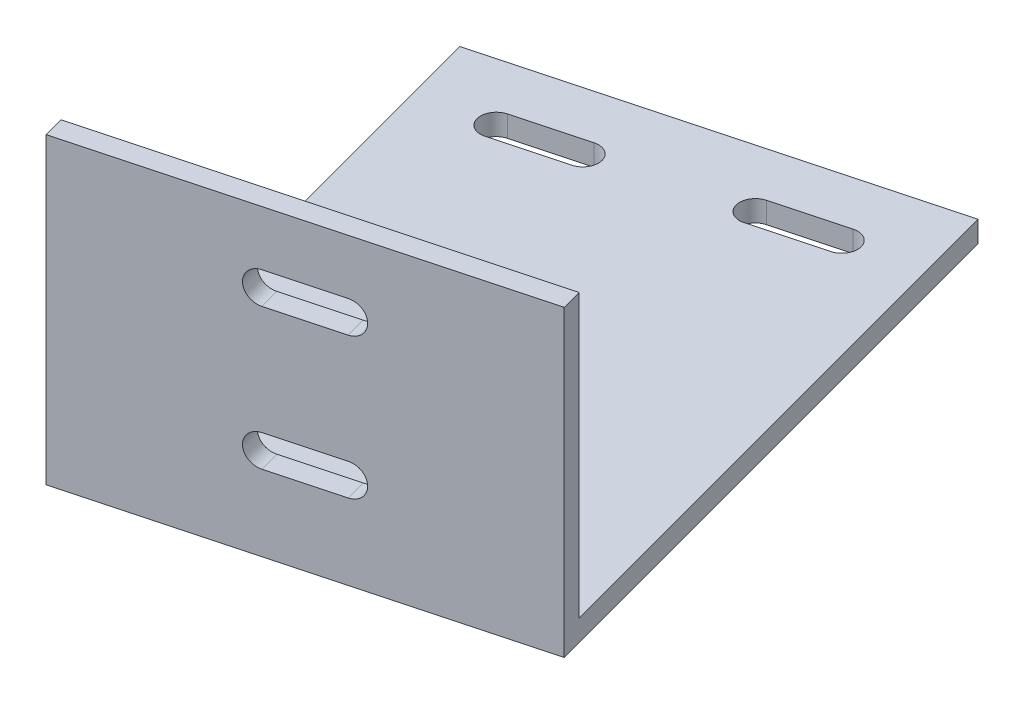
ISO-10303-21;
HEADER;
FILE_DESCRIPTION(('STEP AP214'),'2;1');
FILE_NAME('part.step','',(''),(''),'','','');
FILE_SCHEMA(('AUTOMOTIVE_DESIGN { 1 0 10303 214 1 1 1 1 }'));
ENDSEC;
DATA;
#1=APPLICATION_CONTEXT('core data for automotive mechanical design processes');
#2=APPLICATION_PROTOCOL_DEFINITION('international standard','automotive_design',2000,#1);
#3=PRODUCT_CONTEXT('',#1,'mechanical');
#4=PRODUCT('Part','Part','',(#3));
#5=PRODUCT_RELATED_PRODUCT_CATEGORY('part','',(#4));
#6=PRODUCT_DEFINITION_FORMATION('','',#4);
#7=PRODUCT_DEFINITION_CONTEXT('part definition',#1,'design');
#8=PRODUCT_DEFINITION('design','',#6,#7);
#9=PRODUCT_DEFINITION_SHAPE('','',#8);
#10=(LENGTH_UNIT() NAMED_UNIT(*) SI_UNIT(.MILLI.,.METRE.));
#11=(NAMED_UNIT(*) PLANE_ANGLE_UNIT() SI_UNIT($,.RADIAN.));
#12=(NAMED_UNIT(*) SI_UNIT($,.STERADIAN.) SOLID_ANGLE_UNIT());
#13=UNCERTAINTY_MEASURE_WITH_UNIT(LENGTH_MEASURE(1.E-05),#10,'distance_accuracy_value','');
#14=(GEOMETRIC_REPRESENTATION_CONTEXT(3) GLOBAL_UNCERTAINTY_ASSIGNED_CONTEXT((#13)) GLOBAL_UNIT_ASSIGNED_CONTEXT((#10,
#11,#12)) REPRESENTATION_CONTEXT('',''));
#15=CARTESIAN_POINT('',(0.,0.,0.));
#16=DIRECTION('',(0.,0.,1.));
#17=DIRECTION('',(1.,0.,0.));
#18=AXIS2_PLACEMENT_3D('',#15,#16,#17);
#19=CARTESIAN_POINT('',(1820.88273357,-1599.,2444.101414841));
#20=DIRECTION('',(-0.258819045102985,0.,-0.965925826288944));
#21=DIRECTION('',(0.,1.,0.));
#22=AXIS2_PLACEMENT_3D('',#19,#20,#21);
#23=CYLINDRICAL_SURFACE('',#22,4.5);
#24=DIRECTION('',(0.258819045102985,0.,0.965925826288944));
#25=VECTOR('',#24,1.);
#26=CARTESIAN_POINT('',(1820.88273357,-1603.5,2444.101414841));
#27=LINE('',#26,#25);
#28=CARTESIAN_POINT('',(1820.88532176,-1603.5,2444.111074099));
#29=VERTEX_POINT('',#28);
#30=CARTESIAN_POINT('',(1822.438236031,-1603.5,2449.906629057));
#31=VERTEX_POINT('',#30);
#32=EDGE_CURVE('E11',#29,#31,#27,.T.);
#33=ORIENTED_EDGE('',*,*,#32,.T.);
#34=CARTESIAN_POINT('',(1822.438236031,-1599.,2449.906629057));
#35=DIRECTION('',(-0.258819045102985,0.,-0.965925826288944));
#36=DIRECTION('',(0.,1.,0.));
#37=AXIS2_PLACEMENT_3D('',#34,#35,#36);
#38=CIRCLE('',#37,4.5);
#39=CARTESIAN_POINT('',(1822.438236031,-1594.5,2449.906629057));
#40=VERTEX_POINT('',#39);
#41=EDGE_CURVE('E221',#40,#31,#38,.T.);
#42=ORIENTED_EDGE('',*,*,#41,.F.);
#43=DIRECTION('',(0.258819045102985,0.,0.965925826288944));
#44=VECTOR('',#43,1.);
#45=CARTESIAN_POINT('',(1820.88273357,-1594.5,2444.101414841));
#46=LINE('',#45,#44);
#47=CARTESIAN_POINT('',(1820.88532176,-1594.5,2444.111074099));
#48=VERTEX_POINT('',#47);
#49=EDGE_CURVE('E207',#48,#40,#46,.T.);
#50=ORIENTED_EDGE('',*,*,#49,.F.);
#51=CARTESIAN_POINT('',(1820.88532176,-1599.,2444.111074099));
#52=DIRECTION('',(-0.258819045102985,0.,-0.965925826288944));
#53=DIRECTION('',(0.,1.,0.));
#54=AXIS2_PLACEMENT_3D('',#51,#52,#53);
#55=CIRCLE('',#54,4.5);
#56=EDGE_CURVE('E617',#48,#29,#55,.T.);
#57=ORIENTED_EDGE('',*,*,#56,.T.);
#58=EDGE_LOOP('',(#33,#42,#50,#57));
#59=FACE_BOUND('',#58,.T.);
#60=ADVANCED_FACE('F17',(#59),#23,.F.);
#61=CARTESIAN_POINT('',(1820.88273357,-1603.5,2444.101414841));
#62=DIRECTION('',(0.,-1.,0.));
#63=DIRECTION('',(0.,0.,-1.));
#64=AXIS2_PLACEMENT_3D('',#61,#62,#63);
#65=PLANE('',#64);
#66=DIRECTION('',(0.258819045102985,0.,0.965925826288944));
#67=VECTOR('',#66,1.);
#68=CARTESIAN_POINT('',(1801.564217044,-1603.5,2449.277795743));
#69=LINE('',#68,#67);
#70=CARTESIAN_POINT('',(1801.566805235,-1603.5,2449.287455001));
#71=VERTEX_POINT('',#70);
#72=CARTESIAN_POINT('',(1803.119719505,-1603.5,2455.083009959));
#73=VERTEX_POINT('',#72);
#74=EDGE_CURVE('E27',#71,#73,#69,.T.);
#75=ORIENTED_EDGE('',*,*,#74,.T.);
#76=DIRECTION('',(0.965925826288944,0.,-0.258819045102985));
#77=VECTOR('',#76,1.);
#78=CARTESIAN_POINT('',(1788.630832111,-1603.5,2458.965295635));
#79=LINE('',#78,#77);
#80=EDGE_CURVE('E214',#73,#31,#79,.T.);
#81=ORIENTED_EDGE('',*,*,#80,.T.);
#82=ORIENTED_EDGE('',*,*,#32,.F.);
#83=DIRECTION('',(0.965925826288944,0.,-0.258819045102985));
#84=VECTOR('',#83,1.);
#85=CARTESIAN_POINT('',(1787.07791784,-1603.5,2453.169740677));
#86=LINE('',#85,#84);
#87=EDGE_CURVE('E613',#71,#29,#86,.T.);
#88=ORIENTED_EDGE('',*,*,#87,.F.);
#89=EDGE_LOOP('',(#75,#81,#82,#88));
#90=FACE_BOUND('',#89,.T.);
#91=ADVANCED_FACE('F19',(#90),#65,.F.);
#92=CARTESIAN_POINT('',(1801.564217044,-1599.,2449.277795743));
#93=DIRECTION('',(-0.258819045102985,0.,-0.965925826288944));
#94=DIRECTION('',(0.,-1.,0.));
#95=AXIS2_PLACEMENT_3D('',#92,#93,#94);
#96=CYLINDRICAL_SURFACE('',#95,4.5);
#97=DIRECTION('',(0.258819045102985,0.,0.965925826288944));
#98=VECTOR('',#97,1.);
#99=CARTESIAN_POINT('',(1801.564217044,-1594.5,2449.277795743));
#100=LINE('',#99,#98);
#101=CARTESIAN_POINT('',(1801.566805235,-1594.5,2449.287455001));
#102=VERTEX_POINT('',#101);
#103=CARTESIAN_POINT('',(1803.119719505,-1594.5,2455.083009959));
#104=VERTEX_POINT('',#103);
#105=EDGE_CURVE('E195',#102,#104,#100,.T.);
#106=ORIENTED_EDGE('',*,*,#105,.T.);
#107=CARTESIAN_POINT('',(1803.119719505,-1599.,2455.083009959));
#108=DIRECTION('',(-0.258819045102985,0.,-0.965925826288944));
#109=DIRECTION('',(0.,-1.,0.));
#110=AXIS2_PLACEMENT_3D('',#107,#108,#109);
#111=CIRCLE('',#110,4.5);
#112=EDGE_CURVE('E198',#73,#104,#111,.T.);
#113=ORIENTED_EDGE('',*,*,#112,.F.);
#114=ORIENTED_EDGE('',*,*,#74,.F.);
#115=CARTESIAN_POINT('',(1801.566805235,-1599.,2449.287455001));
#116=DIRECTION('',(-0.258819045102985,0.,-0.965925826288944));
#117=DIRECTION('',(0.,-1.,0.));
#118=AXIS2_PLACEMENT_3D('',#115,#116,#117);
#119=CIRCLE('',#118,4.5);
#120=EDGE_CURVE('E201',#71,#102,#119,.T.);
#121=ORIENTED_EDGE('',*,*,#120,.T.);
#122=EDGE_LOOP('',(#106,#113,#114,#121));
#123=FACE_BOUND('',#122,.T.);
#124=ADVANCED_FACE('F197',(#123),#96,.F.);
#125=CARTESIAN_POINT('',(1801.564217044,-1594.5,2449.277795743));
#126=DIRECTION('',(0.,1.,0.));
#127=DIRECTION('',(1.,0.,0.));
#128=AXIS2_PLACEMENT_3D('',#125,#126,#127);
#129=PLANE('',#128);
#130=ORIENTED_EDGE('',*,*,#49,.T.);
#131=DIRECTION('',(-0.965925826288944,0.,0.258819045102985));
#132=VECTOR('',#131,1.);
#133=CARTESIAN_POINT('',(1778.971573848,-1594.5,2461.553486086));
#134=LINE('',#133,#132);
#135=EDGE_CURVE('E213',#40,#104,#134,.T.);
#136=ORIENTED_EDGE('',*,*,#135,.T.);
#137=ORIENTED_EDGE('',*,*,#105,.F.);
#138=DIRECTION('',(-0.965925826288944,0.,0.258819045102985));
#139=VECTOR('',#138,1.);
#140=CARTESIAN_POINT('',(1777.418659577,-1594.5,2455.757931128));
#141=LINE('',#140,#139);
#142=EDGE_CURVE('E483',#48,#102,#141,.T.);
#143=ORIENTED_EDGE('',*,*,#142,.F.);
#144=EDGE_LOOP('',(#130,#136,#137,#143));
#145=FACE_BOUND('',#144,.T.);
#146=ADVANCED_FACE('F218',(#145),#129,.F.);
#147=CARTESIAN_POINT('',(1820.88273357,-1643.5,2444.101414841));
#148=DIRECTION('',(0.,-1.,0.));
#149=DIRECTION('',(0.,0.,-1.));
#150=AXIS2_PLACEMENT_3D('',#147,#148,#149);
#151=PLANE('',#150);
#152=DIRECTION('',(0.258819045102985,0.,0.965925826288944));
#153=VECTOR('',#152,1.);
#154=CARTESIAN_POINT('',(1801.564217044,-1643.5,2449.277795743));
#155=LINE('',#154,#153);
#156=CARTESIAN_POINT('',(1801.566805235,-1643.5,2449.287455001));
#157=VERTEX_POINT('',#156);
#158=CARTESIAN_POINT('',(1803.119719505,-1643.5,2455.083009959));
#159=VERTEX_POINT('',#158);
#160=EDGE_CURVE('E261',#157,#159,#155,.T.);
#161=ORIENTED_EDGE('',*,*,#160,.T.);
#162=DIRECTION('',(0.965925826288944,0.,-0.258819045102985));
#163=VECTOR('',#162,1.);
#164=CARTESIAN_POINT('',(1788.630832111,-1643.5,2458.965295635));
#165=LINE('',#164,#163);
#166=CARTESIAN_POINT('',(1822.438236031,-1643.5,2449.906629057));
#167=VERTEX_POINT('',#166);
#168=EDGE_CURVE('E231',#159,#167,#165,.T.);
#169=ORIENTED_EDGE('',*,*,#168,.T.);
#170=DIRECTION('',(0.258819045102985,0.,0.965925826288944));
#171=VECTOR('',#170,1.);
#172=CARTESIAN_POINT('',(1820.88273357,-1643.5,2444.101414841));
#173=LINE('',#172,#171);
#174=CARTESIAN_POINT('',(1820.88532176,-1643.5,2444.111074099));
#175=VERTEX_POINT('',#174);
#176=EDGE_CURVE('E258',#175,#167,#173,.T.);
#177=ORIENTED_EDGE('',*,*,#176,.F.);
#178=DIRECTION('',(0.965925826288944,0.,-0.258819045102985));
#179=VECTOR('',#178,1.);
#180=CARTESIAN_POINT('',(1787.07791784,-1643.5,2453.169740677));
#181=LINE('',#180,#179);
#182=EDGE_CURVE('E539',#157,#175,#181,.T.);
#183=ORIENTED_EDGE('',*,*,#182,.F.);
#184=EDGE_LOOP('',(#161,#169,#177,#183));
#185=FACE_BOUND('',#184,.T.);
#186=ADVANCED_FACE('F427',(#185),#151,.F.);
#187=CARTESIAN_POINT('',(1801.564217044,-1639.,2449.277795743));
#188=DIRECTION('',(-0.258819045102985,0.,-0.965925826288944));
#189=DIRECTION('',(0.,-1.,0.));
#190=AXIS2_PLACEMENT_3D('',#187,#188,#189);
#191=CYLINDRICAL_SURFACE('',#190,4.5);
#192=DIRECTION('',(0.258819045102985,0.,0.965925826288944));
#193=VECTOR('',#192,1.);
#194=CARTESIAN_POINT('',(1801.564217044,-1634.5,2449.277795743));
#195=LINE('',#194,#193);
#196=CARTESIAN_POINT('',(1801.566805235,-1634.5,2449.287455001));
#197=VERTEX_POINT('',#196);
#198=CARTESIAN_POINT('',(1803.119719505,-1634.5,2455.083009959));
#199=VERTEX_POINT('',#198);
#200=EDGE_CURVE('E255',#197,#199,#195,.T.);
#201=ORIENTED_EDGE('',*,*,#200,.T.);
#202=CARTESIAN_POINT('',(1803.119719505,-1639.,2455.083009959));
#203=DIRECTION('',(-0.258819045102985,0.,-0.965925826288944));
#204=DIRECTION('',(0.,-1.,0.));
#205=AXIS2_PLACEMENT_3D('',#202,#203,#204);
#206=CIRCLE('',#205,4.5);
#207=EDGE_CURVE('E222',#159,#199,#206,.T.);
#208=ORIENTED_EDGE('',*,*,#207,.F.);
#209=ORIENTED_EDGE('',*,*,#160,.F.);
#210=CARTESIAN_POINT('',(1801.566805235,-1639.,2449.287455001));
#211=DIRECTION('',(-0.258819045102985,0.,-0.965925826288944));
#212=DIRECTION('',(0.,-1.,0.));
#213=AXIS2_PLACEMENT_3D('',#210,#211,#212);
#214=CIRCLE('',#213,4.5);
#215=EDGE_CURVE('E544',#157,#197,#214,.T.);
#216=ORIENTED_EDGE('',*,*,#215,.T.);
#217=EDGE_LOOP('',(#201,#208,#209,#216));
#218=FACE_BOUND('',#217,.T.);
#219=ADVANCED_FACE('F419',(#218),#191,.F.);
#220=CARTESIAN_POINT('',(1820.88273357,-1639.,2444.101414841));
#221=DIRECTION('',(-0.258819045102985,0.,-0.965925826288944));
#222=DIRECTION('',(0.,1.,0.));
#223=AXIS2_PLACEMENT_3D('',#220,#221,#222);
#224=CYLINDRICAL_SURFACE('',#223,4.5);
#225=ORIENTED_EDGE('',*,*,#176,.T.);
#226=CARTESIAN_POINT('',(1822.438236031,-1639.,2449.906629057));
#227=DIRECTION('',(-0.258819045102985,0.,-0.965925826288944));
#228=DIRECTION('',(0.,1.,0.));
#229=AXIS2_PLACEMENT_3D('',#226,#227,#228);
#230=CIRCLE('',#229,4.5);
#231=CARTESIAN_POINT('',(1822.438236031,-1634.5,2449.906629057));
#232=VERTEX_POINT('',#231);
#233=EDGE_CURVE('E644',#232,#167,#230,.T.);
#234=ORIENTED_EDGE('',*,*,#233,.F.);
#235=DIRECTION('',(0.258819045102985,0.,0.965925826288944));
#236=VECTOR('',#235,1.);
#237=CARTESIAN_POINT('',(1820.88273357,-1634.5,2444.101414841));
#238=LINE('',#237,#236);
#239=CARTESIAN_POINT('',(1820.88532176,-1634.5,2444.111074099));
#240=VERTEX_POINT('',#239);
#241=EDGE_CURVE('E254',#240,#232,#238,.T.);
#242=ORIENTED_EDGE('',*,*,#241,.F.);
#243=CARTESIAN_POINT('',(1820.88532176,-1639.,2444.111074099));
#244=DIRECTION('',(-0.258819045102985,0.,-0.965925826288944));
#245=DIRECTION('',(0.,1.,0.));
#246=AXIS2_PLACEMENT_3D('',#243,#244,#245);
#247=CIRCLE('',#246,4.5);
#248=EDGE_CURVE('E543',#240,#175,#247,.T.);
#249=ORIENTED_EDGE('',*,*,#248,.T.);
#250=EDGE_LOOP('',(#225,#234,#242,#249));
#251=FACE_BOUND('',#250,.T.);
#252=ADVANCED_FACE('F411',(#251),#224,.F.);
#253=CARTESIAN_POINT('',(1801.564217044,-1634.5,2449.277795743));
#254=DIRECTION('',(0.,1.,0.));
#255=DIRECTION('',(1.,0.,0.));
#256=AXIS2_PLACEMENT_3D('',#253,#254,#255);
#257=PLANE('',#256);
#258=ORIENTED_EDGE('',*,*,#241,.T.);
#259=DIRECTION('',(-0.965925826288944,0.,0.258819045102985));
#260=VECTOR('',#259,1.);
#261=CARTESIAN_POINT('',(1778.971573848,-1634.5,2461.553486086));
#262=LINE('',#261,#260);
#263=EDGE_CURVE('E640',#232,#199,#262,.T.);
#264=ORIENTED_EDGE('',*,*,#263,.T.);
#265=ORIENTED_EDGE('',*,*,#200,.F.);
#266=DIRECTION('',(-0.965925826288944,0.,0.258819045102985));
#267=VECTOR('',#266,1.);
#268=CARTESIAN_POINT('',(1777.418659577,-1634.5,2455.757931128));
#269=LINE('',#268,#267);
#270=EDGE_CURVE('E588',#240,#197,#269,.T.);
#271=ORIENTED_EDGE('',*,*,#270,.F.);
#272=EDGE_LOOP('',(#258,#264,#265,#271));
#273=FACE_BOUND('',#272,.T.);
#274=ADVANCED_FACE('F366',(#273),#257,.F.);
#275=CARTESIAN_POINT('',(1813.628430235,-1665.01,2301.116887065));
#276=DIRECTION('',(0.,-1.,0.));
#277=DIRECTION('',(-0.258819045102985,0.,-0.965925826288944));
#278=AXIS2_PLACEMENT_3D('',#275,#276,#277);
#279=CYLINDRICAL_SURFACE('',#278,4.5);
#280=DIRECTION('',(0.,1.,0.));
#281=VECTOR('',#280,1.);
#282=CARTESIAN_POINT('',(1814.793115938,-1665.01,2305.463553284));
#283=LINE('',#282,#281);
#284=CARTESIAN_POINT('',(1814.793115938,-1665.,2305.463553284));
#285=VERTEX_POINT('',#284);
#286=CARTESIAN_POINT('',(1814.793115938,-1659.,2305.463553284));
#287=VERTEX_POINT('',#286);
#288=EDGE_CURVE('E251',#285,#287,#283,.T.);
#289=ORIENTED_EDGE('',*,*,#288,.T.);
#290=CARTESIAN_POINT('',(1813.628430235,-1659.,2301.116887065));
#291=DIRECTION('',(0.,-1.,0.));
#292=DIRECTION('',(-0.258819045102985,0.,-0.965925826288944));
#293=AXIS2_PLACEMENT_3D('',#290,#291,#292);
#294=CIRCLE('',#293,4.5);
#295=CARTESIAN_POINT('',(1812.463744532,-1659.,2296.770220847));
#296=VERTEX_POINT('',#295);
#297=EDGE_CURVE('E596',#296,#287,#294,.T.);
#298=ORIENTED_EDGE('',*,*,#297,.F.);
#299=DIRECTION('',(0.,1.,0.));
#300=VECTOR('',#299,1.);
#301=CARTESIAN_POINT('',(1812.463744532,-1665.01,2296.770220847));
#302=LINE('',#301,#300);
#303=CARTESIAN_POINT('',(1812.463744532,-1665.,2296.770220847));
#304=VERTEX_POINT('',#303);
#305=EDGE_CURVE('E244',#304,#296,#302,.T.);
#306=ORIENTED_EDGE('',*,*,#305,.F.);
#307=CARTESIAN_POINT('',(1813.628430235,-1665.,2301.116887065));
#308=DIRECTION('',(0.,-1.,0.));
#309=DIRECTION('',(-0.258819045102985,0.,-0.965925826288944));
#310=AXIS2_PLACEMENT_3D('',#307,#308,#309);
#311=CIRCLE('',#310,4.5);
#312=EDGE_CURVE('E534',#304,#285,#311,.T.);
#313=ORIENTED_EDGE('',*,*,#312,.T.);
#314=EDGE_LOOP('',(#289,#298,#306,#313));
#315=FACE_BOUND('',#314,.T.);
#316=ADVANCED_FACE('F361',(#315),#279,.F.);
#317=CARTESIAN_POINT('',(1814.793115938,-1665.01,2305.463553284));
#318=DIRECTION('',(0.258819045102985,0.,0.965925826288944));
#319=DIRECTION('',(0.,-1.,0.));
#320=AXIS2_PLACEMENT_3D('',#317,#318,#319);
#321=PLANE('',#320);
#322=DIRECTION('',(0.,1.,0.));
#323=VECTOR('',#322,1.);
#324=CARTESIAN_POINT('',(1795.474599412,-1665.01,2310.639934186));
#325=LINE('',#324,#323);
#326=CARTESIAN_POINT('',(1795.474599412,-1665.,2310.639934186));
#327=VERTEX_POINT('',#326);
#328=CARTESIAN_POINT('',(1795.474599412,-1659.,2310.639934186));
#329=VERTEX_POINT('',#328);
#330=EDGE_CURVE('E248',#327,#329,#325,.T.);
#331=ORIENTED_EDGE('',*,*,#330,.T.);
#332=DIRECTION('',(0.965925826288944,0.,-0.258819045102985));
#333=VECTOR('',#332,1.);
#334=CARTESIAN_POINT('',(1766.496824623,-1659.,2318.404505539));
#335=LINE('',#334,#333);
#336=EDGE_CURVE('E600',#329,#287,#335,.T.);
#337=ORIENTED_EDGE('',*,*,#336,.T.);
#338=ORIENTED_EDGE('',*,*,#288,.F.);
#339=DIRECTION('',(0.965925826288944,0.,-0.258819045102985));
#340=VECTOR('',#339,1.);
#341=CARTESIAN_POINT('',(1766.496824623,-1665.,2318.404505539));
#342=LINE('',#341,#340);
#343=EDGE_CURVE('E509',#327,#285,#342,.T.);
#344=ORIENTED_EDGE('',*,*,#343,.F.);
#345=EDGE_LOOP('',(#331,#337,#338,#344));
#346=FACE_BOUND('',#345,.T.);
#347=ADVANCED_FACE('F365',(#346),#321,.F.);
#348=CARTESIAN_POINT('',(1794.309913709,-1665.01,2306.293267967));
#349=DIRECTION('',(0.,-1.,0.));
#350=DIRECTION('',(0.258819045102985,0.,0.965925826288944));
#351=AXIS2_PLACEMENT_3D('',#348,#349,#350);
#352=CYLINDRICAL_SURFACE('',#351,4.5);
#353=DIRECTION('',(0.,1.,0.));
#354=VECTOR('',#353,1.);
#355=CARTESIAN_POINT('',(1793.145228006,-1665.01,2301.946601749));
#356=LINE('',#355,#354);
#357=CARTESIAN_POINT('',(1793.145228006,-1665.,2301.946601749));
#358=VERTEX_POINT('',#357);
#359=CARTESIAN_POINT('',(1793.145228006,-1659.,2301.946601749));
#360=VERTEX_POINT('',#359);
#361=EDGE_CURVE('E247',#358,#360,#356,.T.);
#362=ORIENTED_EDGE('',*,*,#361,.T.);
#363=CARTESIAN_POINT('',(1794.309913709,-1659.,2306.293267967));
#364=DIRECTION('',(0.,-1.,0.));
#365=DIRECTION('',(0.258819045102985,0.,0.965925826288944));
#366=AXIS2_PLACEMENT_3D('',#363,#364,#365);
#367=CIRCLE('',#366,4.5);
#368=EDGE_CURVE('E605',#329,#360,#367,.T.);
#369=ORIENTED_EDGE('',*,*,#368,.F.);
#370=ORIENTED_EDGE('',*,*,#330,.F.);
#371=CARTESIAN_POINT('',(1794.309913709,-1665.,2306.293267967));
#372=DIRECTION('',(0.,-1.,0.));
#373=DIRECTION('',(0.258819045102985,0.,0.965925826288944));
#374=AXIS2_PLACEMENT_3D('',#371,#372,#373);
#375=CIRCLE('',#374,4.5);
#376=EDGE_CURVE('E507',#327,#358,#375,.T.);
#377=ORIENTED_EDGE('',*,*,#376,.T.);
#378=EDGE_LOOP('',(#362,#369,#370,#377));
#379=FACE_BOUND('',#378,.T.);
#380=ADVANCED_FACE('F389',(#379),#352,.F.);
#381=CARTESIAN_POINT('',(1793.145228006,-1665.01,2301.946601749));
#382=DIRECTION('',(-0.258819045102985,0.,-0.965925826288944));
#383=DIRECTION('',(-0.965925826288944,0.,0.258819045102985));
#384=AXIS2_PLACEMENT_3D('',#381,#382,#383);
#385=PLANE('',#384);
#386=ORIENTED_EDGE('',*,*,#305,.T.);
#387=DIRECTION('',(-0.965925826288944,0.,0.258819045102985));
#388=VECTOR('',#387,1.);
#389=CARTESIAN_POINT('',(1754.508194954,-1659.,2312.299363553));
#390=LINE('',#389,#388);
#391=EDGE_CURVE('E592',#296,#360,#390,.T.);
#392=ORIENTED_EDGE('',*,*,#391,.T.);
#393=ORIENTED_EDGE('',*,*,#361,.F.);
#394=DIRECTION('',(-0.965925826288944,0.,0.258819045102985));
#395=VECTOR('',#394,1.);
#396=CARTESIAN_POINT('',(1754.508194954,-1665.,2312.299363553));
#397=LINE('',#396,#395);
#398=EDGE_CURVE('E537',#304,#358,#397,.T.);
#399=ORIENTED_EDGE('',*,*,#398,.F.);
#400=EDGE_LOOP('',(#386,#392,#393,#399));
#401=FACE_BOUND('',#400,.T.);
#402=ADVANCED_FACE('F381',(#401),#385,.F.);
#403=CARTESIAN_POINT('',(1756.83756636,-1665.01,2320.99269599));
#404=DIRECTION('',(0.258819045102985,0.,0.965925826288944));
#405=DIRECTION('',(0.,-1.,0.));
#406=AXIS2_PLACEMENT_3D('',#403,#404,#405);
#407=PLANE('',#406);
#408=DIRECTION('',(0.,1.,0.));
#409=VECTOR('',#408,1.);
#410=CARTESIAN_POINT('',(1737.519049835,-1665.01,2326.169076892));
#411=LINE('',#410,#409);
#412=CARTESIAN_POINT('',(1737.519049835,-1665.,2326.169076892));
#413=VERTEX_POINT('',#412);
#414=CARTESIAN_POINT('',(1737.519049835,-1659.,2326.169076892));
#415=VERTEX_POINT('',#414);
#416=EDGE_CURVE('E241',#413,#415,#411,.T.);
#417=ORIENTED_EDGE('',*,*,#416,.T.);
#418=DIRECTION('',(0.965925826288944,0.,-0.258819045102985));
#419=VECTOR('',#418,1.);
#420=CARTESIAN_POINT('',(1737.519049835,-1659.,2326.169076892));
#421=LINE('',#420,#419);
#422=CARTESIAN_POINT('',(1756.83756636,-1659.,2320.99269599));
#423=VERTEX_POINT('',#422);
#424=EDGE_CURVE('E580',#415,#423,#421,.T.);
#425=ORIENTED_EDGE('',*,*,#424,.T.);
#426=DIRECTION('',(0.,1.,0.));
#427=VECTOR('',#426,1.);
#428=CARTESIAN_POINT('',(1756.83756636,-1665.01,2320.99269599));
#429=LINE('',#428,#427);
#430=CARTESIAN_POINT('',(1756.83756636,-1665.,2320.99269599));
#431=VERTEX_POINT('',#430);
#432=EDGE_CURVE('E240',#431,#423,#429,.T.);
#433=ORIENTED_EDGE('',*,*,#432,.F.);
#434=DIRECTION('',(0.965925826288944,0.,-0.258819045102985));
#435=VECTOR('',#434,1.);
#436=CARTESIAN_POINT('',(1737.519049835,-1665.,2326.169076892));
#437=LINE('',#436,#435);
#438=EDGE_CURVE('E528',#413,#431,#437,.T.);
#439=ORIENTED_EDGE('',*,*,#438,.F.);
#440=EDGE_LOOP('',(#417,#425,#433,#439));
#441=FACE_BOUND('',#440,.T.);
#442=ADVANCED_FACE('F305',(#441),#407,.F.);
#443=CARTESIAN_POINT('',(1736.354364132,-1665.01,2321.822410674));
#444=DIRECTION('',(0.,-1.,0.));
#445=DIRECTION('',(0.258819045102985,0.,0.965925826288944));
#446=AXIS2_PLACEMENT_3D('',#443,#444,#445);
#447=CYLINDRICAL_SURFACE('',#446,4.5);
#448=DIRECTION('',(0.,1.,0.));
#449=VECTOR('',#448,1.);
#450=CARTESIAN_POINT('',(1735.189678429,-1665.01,2317.475744455));
#451=LINE('',#450,#449);
#452=CARTESIAN_POINT('',(1735.189678429,-1665.,2317.475744455));
#453=VERTEX_POINT('',#452);
#454=CARTESIAN_POINT('',(1735.189678429,-1659.,2317.475744455));
#455=VERTEX_POINT('',#454);
#456=EDGE_CURVE('E237',#453,#455,#451,.T.);
#457=ORIENTED_EDGE('',*,*,#456,.T.);
#458=CARTESIAN_POINT('',(1736.354364132,-1659.,2321.822410674));
#459=DIRECTION('',(0.,-1.,0.));
#460=DIRECTION('',(0.258819045102985,0.,0.965925826288944));
#461=AXIS2_PLACEMENT_3D('',#458,#459,#460);
#462=CIRCLE('',#461,4.5);
#463=EDGE_CURVE('E584',#415,#455,#462,.T.);
#464=ORIENTED_EDGE('',*,*,#463,.F.);
#465=ORIENTED_EDGE('',*,*,#416,.F.);
#466=CARTESIAN_POINT('',(1736.354364132,-1665.,2321.822410674));
#467=DIRECTION('',(0.,-1.,0.));
#468=DIRECTION('',(0.258819045102985,0.,0.965925826288944));
#469=AXIS2_PLACEMENT_3D('',#466,#467,#468);
#470=CIRCLE('',#469,4.5);
#471=EDGE_CURVE('E524',#413,#453,#470,.T.);
#472=ORIENTED_EDGE('',*,*,#471,.T.);
#473=EDGE_LOOP('',(#457,#464,#465,#472));
#474=FACE_BOUND('',#473,.T.);
#475=ADVANCED_FACE('F300',(#474),#447,.F.);
#476=CARTESIAN_POINT('',(1755.672880657,-1665.01,2316.646029771));
#477=DIRECTION('',(0.,-1.,0.));
#478=DIRECTION('',(-0.258819045102985,0.,-0.965925826288944));
#479=AXIS2_PLACEMENT_3D('',#476,#477,#478);
#480=CYLINDRICAL_SURFACE('',#479,4.5);
#481=ORIENTED_EDGE('',*,*,#432,.T.);
#482=CARTESIAN_POINT('',(1755.672880657,-1659.,2316.646029771));
#483=DIRECTION('',(0.,-1.,0.));
#484=DIRECTION('',(-0.258819045102985,0.,-0.965925826288944));
#485=AXIS2_PLACEMENT_3D('',#482,#483,#484);
#486=CIRCLE('',#485,4.5);
#487=CARTESIAN_POINT('',(1754.508194954,-1659.,2312.299363553));
#488=VERTEX_POINT('',#487);
#489=EDGE_CURVE('E576',#488,#423,#486,.T.);
#490=ORIENTED_EDGE('',*,*,#489,.F.);
#491=DIRECTION('',(0.,1.,0.));
#492=VECTOR('',#491,1.);
#493=CARTESIAN_POINT('',(1754.508194954,-1665.01,2312.299363553));
#494=LINE('',#493,#492);
#495=CARTESIAN_POINT('',(1754.508194954,-1665.,2312.299363553));
#496=VERTEX_POINT('',#495);
#497=EDGE_CURVE('E216',#496,#488,#494,.T.);
#498=ORIENTED_EDGE('',*,*,#497,.F.);
#499=CARTESIAN_POINT('',(1755.672880657,-1665.,2316.646029771));
#500=DIRECTION('',(0.,-1.,0.));
#501=DIRECTION('',(-0.258819045102985,0.,-0.965925826288944));
#502=AXIS2_PLACEMENT_3D('',#499,#500,#501);
#503=CIRCLE('',#502,4.5);
#504=EDGE_CURVE('E548',#496,#431,#503,.T.);
#505=ORIENTED_EDGE('',*,*,#504,.T.);
#506=EDGE_LOOP('',(#481,#490,#498,#505));
#507=FACE_BOUND('',#506,.T.);
#508=ADVANCED_FACE('F304',(#507),#480,.F.);
#509=CARTESIAN_POINT('',(1735.189678429,-1665.01,2317.475744455));
#510=DIRECTION('',(-0.258819045102985,0.,-0.965925826288944));
#511=DIRECTION('',(-0.965925826288944,0.,0.258819045102985));
#512=AXIS2_PLACEMENT_3D('',#509,#510,#511);
#513=PLANE('',#512);
#514=ORIENTED_EDGE('',*,*,#497,.T.);
#515=DIRECTION('',(-0.965925826288944,0.,0.258819045102985));
#516=VECTOR('',#515,1.);
#517=CARTESIAN_POINT('',(1725.530420166,-1659.,2320.063934906));
#518=LINE('',#517,#516);
#519=EDGE_CURVE('E572',#488,#455,#518,.T.);
#520=ORIENTED_EDGE('',*,*,#519,.T.);
#521=ORIENTED_EDGE('',*,*,#456,.F.);
#522=DIRECTION('',(-0.965925826288944,0.,0.258819045102985));
#523=VECTOR('',#522,1.);
#524=CARTESIAN_POINT('',(1725.530420166,-1665.,2320.063934906));
#525=LINE('',#524,#523);
#526=EDGE_CURVE('E510',#496,#453,#525,.T.);
#527=ORIENTED_EDGE('',*,*,#526,.F.);
#528=EDGE_LOOP('',(#514,#520,#521,#527));
#529=FACE_BOUND('',#528,.T.);
#530=ADVANCED_FACE('F349',(#529),#513,.F.);
#531=CARTESIAN_POINT('',(1869.181613075,-1665.,2431.170121844));
#532=DIRECTION('',(0.965925826288944,0.,-0.258819045102985));
#533=DIRECTION('',(0.,-1.,0.));
#534=AXIS2_PLACEMENT_3D('',#531,#532,#533);
#535=PLANE('',#534);
#536=DIRECTION('',(0.258819045102985,0.,0.965925826288944));
#537=VECTOR('',#536,1.);
#538=CARTESIAN_POINT('',(1827.770565858,-1665.,2276.621989638));
#539=LINE('',#538,#537);
#540=CARTESIAN_POINT('',(1827.770565858,-1665.,2276.621989638));
#541=VERTEX_POINT('',#540);
#542=CARTESIAN_POINT('',(1870.734527345,-1665.,2436.965676801));
#543=VERTEX_POINT('',#542);
#544=EDGE_CURVE('E516',#541,#543,#539,.T.);
#545=ORIENTED_EDGE('',*,*,#544,.F.);
#546=DIRECTION('',(0.,1.,0.));
#547=VECTOR('',#546,1.);
#548=CARTESIAN_POINT('',(1827.770565858,-1665.,2276.621989638));
#549=LINE('',#548,#547);
#550=CARTESIAN_POINT('',(1827.770565858,-1659.,2276.621989638));
#551=VERTEX_POINT('',#550);
#552=EDGE_CURVE('E564',#541,#551,#549,.T.);
#553=ORIENTED_EDGE('',*,*,#552,.T.);
#554=DIRECTION('',(0.258819045102985,0.,0.965925826288944));
#555=VECTOR('',#554,1.);
#556=CARTESIAN_POINT('',(1827.770565858,-1659.,2276.621989638));
#557=LINE('',#556,#555);
#558=CARTESIAN_POINT('',(1869.181613075,-1659.,2431.170121844));
#559=VERTEX_POINT('',#558);
#560=EDGE_CURVE('E568',#551,#559,#557,.T.);
#561=ORIENTED_EDGE('',*,*,#560,.T.);
#562=DIRECTION('',(0.,1.,0.));
#563=VECTOR('',#562,1.);
#564=CARTESIAN_POINT('',(1869.181613075,-1665.,2431.170121844));
#565=LINE('',#564,#563);
#566=CARTESIAN_POINT('',(1869.181613075,-1579.,2431.170121844));
#567=VERTEX_POINT('',#566);
#568=EDGE_CURVE('E612',#559,#567,#565,.T.);
#569=ORIENTED_EDGE('',*,*,#568,.T.);
#570=DIRECTION('',(0.258819045102985,0.,0.965925826288944));
#571=VECTOR('',#570,1.);
#572=CARTESIAN_POINT('',(1869.181613075,-1579.,2431.170121844));
#573=LINE('',#572,#571);
#574=CARTESIAN_POINT('',(1870.734527345,-1579.,2436.965676801));
#575=VERTEX_POINT('',#574);
#576=EDGE_CURVE('E482',#567,#575,#573,.T.);
#577=ORIENTED_EDGE('',*,*,#576,.T.);
#578=DIRECTION('',(0.,1.,0.));
#579=VECTOR('',#578,1.);
#580=CARTESIAN_POINT('',(1870.734527345,-1665.,2436.965676801));
#581=LINE('',#580,#579);
#582=EDGE_CURVE('E479',#543,#575,#581,.T.);
#583=ORIENTED_EDGE('',*,*,#582,.F.);
#584=EDGE_LOOP('',(#545,#553,#561,#569,#577,#583));
#585=FACE_BOUND('',#584,.T.);
#586=ADVANCED_FACE('F342',(#585),#535,.T.);
#587=CARTESIAN_POINT('',(1754.823428191,-1665.,2468.023962214));
#588=DIRECTION('',(0.258819045102985,0.,0.965925826288944));
#589=DIRECTION('',(0.,-1.,0.));
#590=AXIS2_PLACEMENT_3D('',#587,#588,#589);
#591=PLANE('',#590);
#592=ORIENTED_EDGE('',*,*,#135,.F.);
#593=ORIENTED_EDGE('',*,*,#41,.T.);
#594=ORIENTED_EDGE('',*,*,#80,.F.);
#595=ORIENTED_EDGE('',*,*,#112,.T.);
#596=EDGE_LOOP('',(#592,#593,#594,#595));
#597=FACE_BOUND('',#596,.T.);
#598=ORIENTED_EDGE('',*,*,#263,.F.);
#599=ORIENTED_EDGE('',*,*,#233,.T.);
#600=ORIENTED_EDGE('',*,*,#168,.F.);
#601=ORIENTED_EDGE('',*,*,#207,.T.);
#602=EDGE_LOOP('',(#598,#599,#600,#601));
#603=FACE_BOUND('',#602,.T.);
#604=DIRECTION('',(0.,1.,0.));
#605=VECTOR('',#604,1.);
#606=CARTESIAN_POINT('',(1754.823428191,-1665.,2468.023962214));
#607=LINE('',#606,#605);
#608=CARTESIAN_POINT('',(1754.823428191,-1665.,2468.023962214));
#609=VERTEX_POINT('',#608);
#610=CARTESIAN_POINT('',(1754.823428191,-1579.,2468.023962214));
#611=VERTEX_POINT('',#610);
#612=EDGE_CURVE('E478',#609,#611,#607,.T.);
#613=ORIENTED_EDGE('',*,*,#612,.F.);
#614=DIRECTION('',(0.965925826288944,0.,-0.258819045102985));
#615=VECTOR('',#614,1.);
#616=CARTESIAN_POINT('',(1754.823428191,-1665.,2468.023962214));
#617=LINE('',#616,#615);
#618=EDGE_CURVE('E505',#609,#543,#617,.T.);
#619=ORIENTED_EDGE('',*,*,#618,.T.);
#620=ORIENTED_EDGE('',*,*,#582,.T.);
#621=DIRECTION('',(0.965925826288944,0.,-0.258819045102985));
#622=VECTOR('',#621,1.);
#623=CARTESIAN_POINT('',(1754.823428191,-1579.,2468.023962214));
#624=LINE('',#623,#622);
#625=EDGE_CURVE('E474',#611,#575,#624,.T.);
#626=ORIENTED_EDGE('',*,*,#625,.F.);
#627=EDGE_LOOP('',(#613,#619,#620,#626));
#628=FACE_BOUND('',#627,.T.);
#629=ADVANCED_FACE('F210',(#597,#603,#628),#591,.T.);
#630=CARTESIAN_POINT('',(1753.27051392,-1579.,2462.228407256));
#631=DIRECTION('',(0.,1.,0.));
#632=DIRECTION('',(1.,0.,0.));
#633=AXIS2_PLACEMENT_3D('',#630,#631,#632);
#634=PLANE('',#633);
#635=DIRECTION('',(0.965925826288944,0.,-0.258819045102985));
#636=VECTOR('',#635,1.);
#637=CARTESIAN_POINT('',(1753.27051392,-1579.,2462.228407256));
#638=LINE('',#637,#636);
#639=CARTESIAN_POINT('',(1753.27051392,-1579.,2462.228407256));
#640=VERTEX_POINT('',#639);
#641=EDGE_CURVE('E488',#640,#567,#638,.T.);
#642=ORIENTED_EDGE('',*,*,#641,.F.);
#643=DIRECTION('',(0.258819045102985,0.,0.965925826288944));
#644=VECTOR('',#643,1.);
#645=CARTESIAN_POINT('',(1753.27051392,-1579.,2462.228407256));
#646=LINE('',#645,#644);
#647=EDGE_CURVE('E486',#640,#611,#646,.T.);
#648=ORIENTED_EDGE('',*,*,#647,.T.);
#649=ORIENTED_EDGE('',*,*,#625,.T.);
#650=ORIENTED_EDGE('',*,*,#576,.F.);
#651=EDGE_LOOP('',(#642,#648,#649,#650));
#652=FACE_BOUND('',#651,.T.);
#653=ADVANCED_FACE('F272',(#652),#634,.T.);
#654=CARTESIAN_POINT('',(1753.27051392,-1665.,2462.228407256));
#655=DIRECTION('',(0.258819045102985,0.,0.965925826288944));
#656=DIRECTION('',(0.,-1.,0.));
#657=AXIS2_PLACEMENT_3D('',#654,#655,#656);
#658=PLANE('',#657);
#659=ORIENTED_EDGE('',*,*,#120,.F.);
#660=ORIENTED_EDGE('',*,*,#87,.T.);
#661=ORIENTED_EDGE('',*,*,#56,.F.);
#662=ORIENTED_EDGE('',*,*,#142,.T.);
#663=EDGE_LOOP('',(#659,#660,#661,#662));
#664=FACE_BOUND('',#663,.T.);
#665=ORIENTED_EDGE('',*,*,#215,.F.);
#666=ORIENTED_EDGE('',*,*,#182,.T.);
#667=ORIENTED_EDGE('',*,*,#248,.F.);
#668=ORIENTED_EDGE('',*,*,#270,.T.);
#669=EDGE_LOOP('',(#665,#666,#667,#668));
#670=FACE_BOUND('',#669,.T.);
#671=ORIENTED_EDGE('',*,*,#641,.T.);
#672=ORIENTED_EDGE('',*,*,#568,.F.);
#673=DIRECTION('',(-0.965925826288944,0.,0.258819045102985));
#674=VECTOR('',#673,1.);
#675=CARTESIAN_POINT('',(1753.27051392,-1659.,2462.228407256));
#676=LINE('',#675,#674);
#677=CARTESIAN_POINT('',(1753.27051392,-1659.,2462.228407256));
#678=VERTEX_POINT('',#677);
#679=EDGE_CURVE('E569',#559,#678,#676,.T.);
#680=ORIENTED_EDGE('',*,*,#679,.T.);
#681=DIRECTION('',(0.,1.,0.));
#682=VECTOR('',#681,1.);
#683=CARTESIAN_POINT('',(1753.27051392,-1665.,2462.228407256));
#684=LINE('',#683,#682);
#685=EDGE_CURVE('E492',#678,#640,#684,.T.);
#686=ORIENTED_EDGE('',*,*,#685,.T.);
#687=EDGE_LOOP('',(#671,#672,#680,#686));
#688=FACE_BOUND('',#687,.T.);
#689=ADVANCED_FACE('F277',(#664,#670,#688),#658,.F.);
#690=CARTESIAN_POINT('',(1711.859466704,-1659.,2307.68027505));
#691=DIRECTION('',(0.,1.,0.));
#692=DIRECTION('',(1.,0.,0.));
#693=AXIS2_PLACEMENT_3D('',#690,#691,#692);
#694=PLANE('',#693);
#695=ORIENTED_EDGE('',*,*,#391,.F.);
#696=ORIENTED_EDGE('',*,*,#297,.T.);
#697=ORIENTED_EDGE('',*,*,#336,.F.);
#698=ORIENTED_EDGE('',*,*,#368,.T.);
#699=EDGE_LOOP('',(#695,#696,#697,#698));
#700=FACE_BOUND('',#699,.T.);
#701=ORIENTED_EDGE('',*,*,#519,.F.);
#702=ORIENTED_EDGE('',*,*,#489,.T.);
#703=ORIENTED_EDGE('',*,*,#424,.F.);
#704=ORIENTED_EDGE('',*,*,#463,.T.);
#705=EDGE_LOOP('',(#701,#702,#703,#704));
#706=FACE_BOUND('',#705,.T.);
#707=ORIENTED_EDGE('',*,*,#560,.F.);
#708=DIRECTION('',(0.965925826288944,0.,-0.258819045102985));
#709=VECTOR('',#708,1.);
#710=CARTESIAN_POINT('',(1711.859466704,-1659.,2307.68027505));
#711=LINE('',#710,#709);
#712=CARTESIAN_POINT('',(1711.859466704,-1659.,2307.68027505));
#713=VERTEX_POINT('',#712);
#714=EDGE_CURVE('E560',#713,#551,#711,.T.);
#715=ORIENTED_EDGE('',*,*,#714,.F.);
#716=DIRECTION('',(0.258819045102985,0.,0.965925826288944));
#717=VECTOR('',#716,1.);
#718=CARTESIAN_POINT('',(1711.859466704,-1659.,2307.68027505));
#719=LINE('',#718,#717);
#720=EDGE_CURVE('E519',#713,#678,#719,.T.);
#721=ORIENTED_EDGE('',*,*,#720,.T.);
#722=ORIENTED_EDGE('',*,*,#679,.F.);
#723=EDGE_LOOP('',(#707,#715,#721,#722));
#724=FACE_BOUND('',#723,.T.);
#725=ADVANCED_FACE('F317',(#700,#706,#724),#694,.T.);
#726=CARTESIAN_POINT('',(1711.859466704,-1665.,2307.68027505));
#727=DIRECTION('',(0.258819045102985,0.,0.965925826288944));
#728=DIRECTION('',(0.,-1.,0.));
#729=AXIS2_PLACEMENT_3D('',#726,#727,#728);
#730=PLANE('',#729);
#731=ORIENTED_EDGE('',*,*,#714,.T.);
#732=ORIENTED_EDGE('',*,*,#552,.F.);
#733=DIRECTION('',(0.965925826288944,0.,-0.258819045102985));
#734=VECTOR('',#733,1.);
#735=CARTESIAN_POINT('',(1711.859466704,-1665.,2307.68027505));
#736=LINE('',#735,#734);
#737=CARTESIAN_POINT('',(1711.859466704,-1665.,2307.68027505));
#738=VERTEX_POINT('',#737);
#739=EDGE_CURVE('E512',#738,#541,#736,.T.);
#740=ORIENTED_EDGE('',*,*,#739,.F.);
#741=DIRECTION('',(0.,1.,0.));
#742=VECTOR('',#741,1.);
#743=CARTESIAN_POINT('',(1711.859466704,-1665.,2307.68027505));
#744=LINE('',#743,#742);
#745=EDGE_CURVE('E523',#738,#713,#744,.T.);
#746=ORIENTED_EDGE('',*,*,#745,.T.);
#747=EDGE_LOOP('',(#731,#732,#740,#746));
#748=FACE_BOUND('',#747,.T.);
#749=ADVANCED_FACE('F295',(#748),#730,.F.);
#750=CARTESIAN_POINT('',(1753.27051392,-1665.,2462.228407256));
#751=DIRECTION('',(0.,1.,0.));
#752=DIRECTION('',(1.,0.,0.));
#753=AXIS2_PLACEMENT_3D('',#750,#751,#752);
#754=PLANE('',#753);
#755=ORIENTED_EDGE('',*,*,#376,.F.);
#756=ORIENTED_EDGE('',*,*,#343,.T.);
#757=ORIENTED_EDGE('',*,*,#312,.F.);
#758=ORIENTED_EDGE('',*,*,#398,.T.);
#759=EDGE_LOOP('',(#755,#756,#757,#758));
#760=FACE_BOUND('',#759,.T.);
#761=ORIENTED_EDGE('',*,*,#471,.F.);
#762=ORIENTED_EDGE('',*,*,#438,.T.);
#763=ORIENTED_EDGE('',*,*,#504,.F.);
#764=ORIENTED_EDGE('',*,*,#526,.T.);
#765=EDGE_LOOP('',(#761,#762,#763,#764));
#766=FACE_BOUND('',#765,.T.);
#767=ORIENTED_EDGE('',*,*,#618,.F.);
#768=DIRECTION('',(0.258819045102985,0.,0.965925826288944));
#769=VECTOR('',#768,1.);
#770=CARTESIAN_POINT('',(1711.859466704,-1665.,2307.68027505));
#771=LINE('',#770,#769);
#772=EDGE_CURVE('E497',#738,#609,#771,.T.);
#773=ORIENTED_EDGE('',*,*,#772,.F.);
#774=ORIENTED_EDGE('',*,*,#739,.T.);
#775=ORIENTED_EDGE('',*,*,#544,.T.);
#776=EDGE_LOOP('',(#767,#773,#774,#775));
#777=FACE_BOUND('',#776,.T.);
#778=ADVANCED_FACE('F287',(#760,#766,#777),#754,.F.);
#779=CARTESIAN_POINT('',(1753.27051392,-1665.,2462.228407256));
#780=DIRECTION('',(0.965925826288944,0.,-0.258819045102985));
#781=DIRECTION('',(0.,-1.,0.));
#782=AXIS2_PLACEMENT_3D('',#779,#780,#781);
#783=PLANE('',#782);
#784=ORIENTED_EDGE('',*,*,#612,.T.);
#785=ORIENTED_EDGE('',*,*,#647,.F.);
#786=ORIENTED_EDGE('',*,*,#685,.F.);
#787=ORIENTED_EDGE('',*,*,#720,.F.);
#788=ORIENTED_EDGE('',*,*,#745,.F.);
#789=ORIENTED_EDGE('',*,*,#772,.T.);
#790=EDGE_LOOP('',(#784,#785,#786,#787,#788,#789));
#791=FACE_BOUND('',#790,.T.);
#792=ADVANCED_FACE('F283',(#791),#783,.F.);
#793=CLOSED_SHELL('',(#60,#91,#124,#146,#186,#219,#252,#274,#316,#347,#380,#402,#442,#475,#508,
#530,#586,#629,#653,#689,#725,#749,#778,#792));
#794=MANIFOLD_SOLID_BREP('B1',#793);
#795=ADVANCED_BREP_SHAPE_REPRESENTATION('',(#18,#794),#14);
#796=SHAPE_DEFINITION_REPRESENTATION(#9,#795);
ENDSEC;
END-ISO-10303-21;
